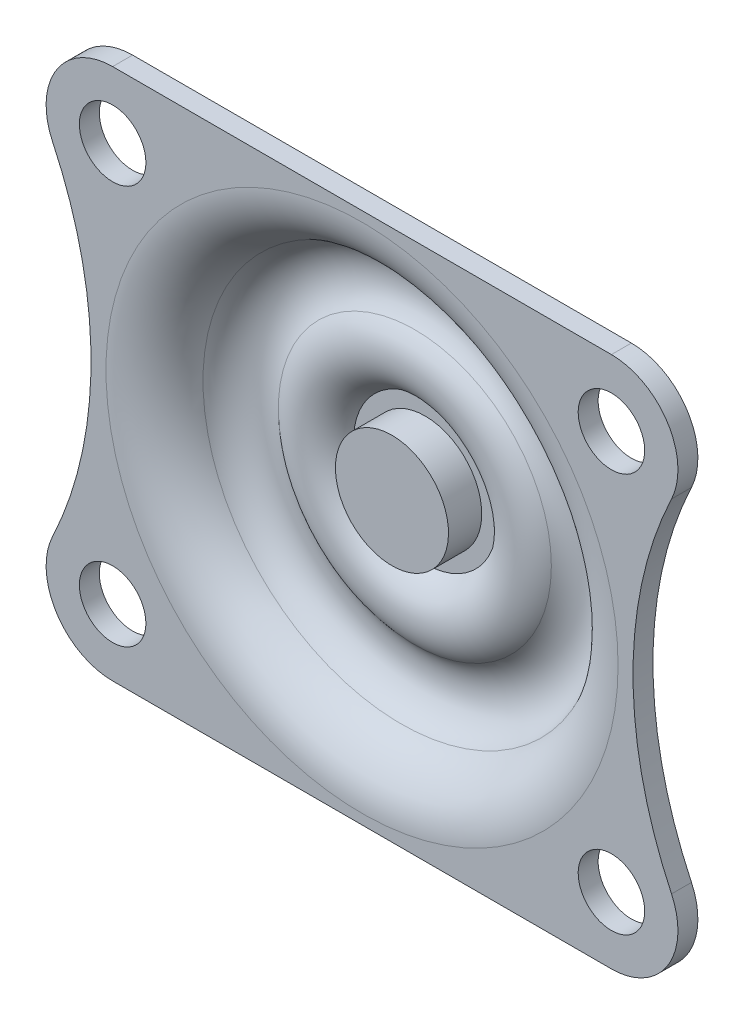
ISO-10303-21;
HEADER;
FILE_DESCRIPTION(('STEP AP214'),'2;1');
FILE_NAME('part.step','',(''),(''),'','','');
FILE_SCHEMA(('AUTOMOTIVE_DESIGN { 1 0 10303 214 1 1 1 1 }'));
ENDSEC;
DATA;
#1=APPLICATION_CONTEXT('core data for automotive mechanical design processes');
#2=APPLICATION_PROTOCOL_DEFINITION('international standard','automotive_design',2000,#1);
#3=PRODUCT_CONTEXT('',#1,'mechanical');
#4=PRODUCT('Part','Part','',(#3));
#5=PRODUCT_RELATED_PRODUCT_CATEGORY('part','',(#4));
#6=PRODUCT_DEFINITION_FORMATION('','',#4);
#7=PRODUCT_DEFINITION_CONTEXT('part definition',#1,'design');
#8=PRODUCT_DEFINITION('design','',#6,#7);
#9=PRODUCT_DEFINITION_SHAPE('','',#8);
#10=(LENGTH_UNIT() NAMED_UNIT(*) SI_UNIT(.MILLI.,.METRE.));
#11=(NAMED_UNIT(*) PLANE_ANGLE_UNIT() SI_UNIT($,.RADIAN.));
#12=(NAMED_UNIT(*) SI_UNIT($,.STERADIAN.) SOLID_ANGLE_UNIT());
#13=UNCERTAINTY_MEASURE_WITH_UNIT(LENGTH_MEASURE(1.E-05),#10,'distance_accuracy_value','');
#14=(GEOMETRIC_REPRESENTATION_CONTEXT(3) GLOBAL_UNCERTAINTY_ASSIGNED_CONTEXT((#13)) GLOBAL_UNIT_ASSIGNED_CONTEXT((#10,
#11,#12)) REPRESENTATION_CONTEXT('',''));
#15=CARTESIAN_POINT('',(0.,0.,0.));
#16=DIRECTION('',(0.,0.,1.));
#17=DIRECTION('',(1.,0.,0.));
#18=AXIS2_PLACEMENT_3D('',#15,#16,#17);
#19=CARTESIAN_POINT('',(0.,15.5,23.2));
#20=DIRECTION('',(0.,0.,1.));
#21=DIRECTION('',(0.,-1.,0.));
#22=AXIS2_PLACEMENT_3D('',#19,#20,#21);
#23=PLANE('',#22);
#24=CARTESIAN_POINT('',(0.,15.5,23.2));
#25=DIRECTION('',(0.,0.,-1.));
#26=DIRECTION('',(0.,1.,0.));
#27=AXIS2_PLACEMENT_3D('',#24,#25,#26);
#28=CIRCLE('',#27,3.4);
#29=CARTESIAN_POINT('',(0.,18.9,23.2));
#30=VERTEX_POINT('',#29);
#31=EDGE_CURVE('E19',#30,#30,#28,.T.);
#32=ORIENTED_EDGE('',*,*,#31,.F.);
#33=EDGE_LOOP('',(#32));
#34=FACE_BOUND('',#33,.T.);
#35=ADVANCED_FACE('F16',(#34),#23,.T.);
#36=CARTESIAN_POINT('',(0.,15.5,21.2));
#37=DIRECTION('',(0.,0.,-1.));
#38=DIRECTION('',(0.,1.,0.));
#39=AXIS2_PLACEMENT_3D('',#36,#37,#38);
#40=CYLINDRICAL_SURFACE('',#39,3.4);
#41=ORIENTED_EDGE('',*,*,#31,.T.);
#42=EDGE_LOOP('',(#41));
#43=FACE_BOUND('',#42,.T.);
#44=CARTESIAN_POINT('',(0.,15.5,21.2));
#45=DIRECTION('',(0.,0.,-1.));
#46=DIRECTION('',(0.,1.,0.));
#47=AXIS2_PLACEMENT_3D('',#44,#45,#46);
#48=CIRCLE('',#47,3.4);
#49=CARTESIAN_POINT('',(0.,18.9,21.2));
#50=VERTEX_POINT('',#49);
#51=EDGE_CURVE('E133',#50,#50,#48,.F.);
#52=ORIENTED_EDGE('',*,*,#51,.T.);
#53=EDGE_LOOP('',(#52));
#54=FACE_BOUND('',#53,.T.);
#55=ADVANCED_FACE('F140',(#43,#54),#40,.T.);
#56=CARTESIAN_POINT('',(0.,15.5,21.2));
#57=DIRECTION('',(0.,0.,-1.));
#58=DIRECTION('',(0.,1.,0.));
#59=AXIS2_PLACEMENT_3D('',#56,#57,#58);
#60=PLANE('',#59);
#61=ORIENTED_EDGE('',*,*,#51,.F.);
#62=EDGE_LOOP('',(#61));
#63=FACE_BOUND('',#62,.T.);
#64=CARTESIAN_POINT('',(0.,15.5,21.2));
#65=DIRECTION('',(0.,0.,1.));
#66=DIRECTION('',(0.,-1.,0.));
#67=AXIS2_PLACEMENT_3D('',#64,#65,#66);
#68=CIRCLE('',#67,4.30682878005387);
#69=CARTESIAN_POINT('',(0.,11.1931712199461,21.2));
#70=VERTEX_POINT('',#69);
#71=EDGE_CURVE('E130',#70,#70,#68,.F.);
#72=ORIENTED_EDGE('',*,*,#71,.F.);
#73=EDGE_LOOP('',(#72));
#74=FACE_BOUND('',#73,.T.);
#75=ADVANCED_FACE('F147',(#63,#74),#60,.F.);
#76=CARTESIAN_POINT('',(0.,15.5,16.7));
#77=DIRECTION('',(0.,0.,-1.));
#78=DIRECTION('',(0.,1.,0.));
#79=AXIS2_PLACEMENT_3D('',#76,#77,#78);
#80=PLANE('',#79);
#81=CARTESIAN_POINT('',(0.,15.5,16.7));
#82=DIRECTION('',(0.,0.,1.));
#83=DIRECTION('',(1.,0.,0.));
#84=AXIS2_PLACEMENT_3D('',#81,#82,#83);
#85=CIRCLE('',#84,4.49999999999996);
#86=CARTESIAN_POINT('',(4.5,15.5,16.7));
#87=VERTEX_POINT('',#86);
#88=EDGE_CURVE('E132',#87,#87,#85,.T.);
#89=ORIENTED_EDGE('',*,*,#88,.F.);
#90=EDGE_LOOP('',(#89));
#91=FACE_BOUND('',#90,.T.);
#92=ADVANCED_FACE('F337',(#91),#80,.T.);
#93=CARTESIAN_POINT('',(0.,15.5,20.));
#94=DIRECTION('',(0.,0.,1.));
#95=DIRECTION('',(1.,0.,0.));
#96=AXIS2_PLACEMENT_3D('',#93,#94,#95);
#97=TOROIDAL_SURFACE('',#96,6.5,2.5);
#98=ORIENTED_EDGE('',*,*,#71,.T.);
#99=EDGE_LOOP('',(#98));
#100=FACE_BOUND('',#99,.T.);
#101=CARTESIAN_POINT('',(0.,15.5,21.8229166666666));
#102=DIRECTION('',(0.,0.,1.));
#103=DIRECTION('',(1.,0.,0.));
#104=AXIS2_PLACEMENT_3D('',#101,#102,#103);
#105=CIRCLE('',#104,8.2108403860056);
#106=CARTESIAN_POINT('',(8.21084038600564,15.5,21.8229166666666));
#107=VERTEX_POINT('',#106);
#108=EDGE_CURVE('E310',#107,#107,#105,.T.);
#109=ORIENTED_EDGE('',*,*,#108,.T.);
#110=EDGE_LOOP('',(#109));
#111=FACE_BOUND('',#110,.T.);
#112=ADVANCED_FACE('F322',(#100,#111),#97,.T.);
#113=CARTESIAN_POINT('',(0.,15.5,17.7));
#114=DIRECTION('',(0.,0.,-1.));
#115=DIRECTION('',(1.,0.,0.));
#116=AXIS2_PLACEMENT_3D('',#113,#114,#115);
#117=TOROIDAL_SURFACE('',#116,4.5,1.);
#118=CARTESIAN_POINT('',(0.,15.5,17.7));
#119=DIRECTION('',(0.,0.,1.));
#120=DIRECTION('',(0.,-1.,0.));
#121=AXIS2_PLACEMENT_3D('',#118,#119,#120);
#122=CIRCLE('',#121,5.5);
#123=CARTESIAN_POINT('',(0.,10.,17.7));
#124=VERTEX_POINT('',#123);
#125=EDGE_CURVE('E302',#124,#124,#122,.T.);
#126=ORIENTED_EDGE('',*,*,#125,.F.);
#127=EDGE_LOOP('',(#126));
#128=FACE_BOUND('',#127,.T.);
#129=ORIENTED_EDGE('',*,*,#88,.T.);
#130=EDGE_LOOP('',(#129));
#131=FACE_BOUND('',#130,.T.);
#132=ADVANCED_FACE('F317',(#128,#131),#117,.T.);
#133=CARTESIAN_POINT('',(0.,15.5,23.5));
#134=DIRECTION('',(0.,0.,1.));
#135=DIRECTION('',(1.,0.,0.));
#136=AXIS2_PLACEMENT_3D('',#133,#134,#135);
#137=TOROIDAL_SURFACE('',#136,9.784813541131,2.3);
#138=CARTESIAN_POINT('',(0.,15.5,22.6449323278882));
#139=DIRECTION('',(0.,0.,1.));
#140=DIRECTION('',(1.,0.,0.));
#141=AXIS2_PLACEMENT_3D('',#138,#139,#140);
#142=CIRCLE('',#141,11.9199620783785);
#143=CARTESIAN_POINT('',(11.9199620783786,15.5,22.6449323278882));
#144=VERTEX_POINT('',#143);
#145=EDGE_CURVE('E129',#144,#144,#142,.F.);
#146=ORIENTED_EDGE('',*,*,#145,.F.);
#147=EDGE_LOOP('',(#146));
#148=FACE_BOUND('',#147,.T.);
#149=ORIENTED_EDGE('',*,*,#108,.F.);
#150=EDGE_LOOP('',(#149));
#151=FACE_BOUND('',#150,.T.);
#152=ADVANCED_FACE('F314',(#148,#151),#137,.F.);
#153=CARTESIAN_POINT('',(0.,15.5,18.7));
#154=DIRECTION('',(0.,0.,1.));
#155=DIRECTION('',(0.,-1.,0.));
#156=AXIS2_PLACEMENT_3D('',#153,#154,#155);
#157=CYLINDRICAL_SURFACE('',#156,5.5);
#158=ORIENTED_EDGE('',*,*,#125,.T.);
#159=EDGE_LOOP('',(#158));
#160=FACE_BOUND('',#159,.T.);
#161=CARTESIAN_POINT('',(0.,15.5,18.7));
#162=DIRECTION('',(0.,0.,1.));
#163=DIRECTION('',(0.,-1.,0.));
#164=AXIS2_PLACEMENT_3D('',#161,#162,#163);
#165=CIRCLE('',#164,5.5);
#166=CARTESIAN_POINT('',(0.,10.,18.7));
#167=VERTEX_POINT('',#166);
#168=EDGE_CURVE('E126',#167,#167,#165,.F.);
#169=ORIENTED_EDGE('',*,*,#168,.T.);
#170=EDGE_LOOP('',(#169));
#171=FACE_BOUND('',#170,.T.);
#172=ADVANCED_FACE('F294',(#160,#171),#157,.T.);
#173=CARTESIAN_POINT('',(0.,15.5,21.251273820018));
#174=DIRECTION('',(0.,0.,1.));
#175=DIRECTION('',(1.,0.,0.));
#176=AXIS2_PLACEMENT_3D('',#173,#174,#175);
#177=TOROIDAL_SURFACE('',#176,15.4,3.748726179982);
#178=ORIENTED_EDGE('',*,*,#145,.T.);
#179=EDGE_LOOP('',(#178));
#180=FACE_BOUND('',#179,.T.);
#181=CARTESIAN_POINT('',(0.,15.5,25.));
#182=DIRECTION('',(0.,0.,1.));
#183=DIRECTION('',(1.,0.,0.));
#184=AXIS2_PLACEMENT_3D('',#181,#182,#183);
#185=CIRCLE('',#184,15.4);
#186=CARTESIAN_POINT('',(15.4,15.5,25.));
#187=VERTEX_POINT('',#186);
#188=EDGE_CURVE('E125',#187,#187,#185,.T.);
#189=ORIENTED_EDGE('',*,*,#188,.T.);
#190=EDGE_LOOP('',(#189));
#191=FACE_BOUND('',#190,.T.);
#192=ADVANCED_FACE('F290',(#180,#191),#177,.T.);
#193=CARTESIAN_POINT('',(0.,15.5,18.7));
#194=DIRECTION('',(0.,0.,-1.));
#195=DIRECTION('',(0.,1.,0.));
#196=AXIS2_PLACEMENT_3D('',#193,#194,#195);
#197=PLANE('',#196);
#198=CARTESIAN_POINT('',(0.,15.5,18.7));
#199=DIRECTION('',(0.,0.,1.));
#200=DIRECTION('',(0.,-1.,0.));
#201=AXIS2_PLACEMENT_3D('',#198,#199,#200);
#202=CIRCLE('',#201,2.);
#203=CARTESIAN_POINT('',(0.,13.5,18.7));
#204=VERTEX_POINT('',#203);
#205=EDGE_CURVE('E88',#204,#204,#202,.T.);
#206=ORIENTED_EDGE('',*,*,#205,.F.);
#207=EDGE_LOOP('',(#206));
#208=FACE_BOUND('',#207,.T.);
#209=ORIENTED_EDGE('',*,*,#168,.F.);
#210=EDGE_LOOP('',(#209));
#211=FACE_BOUND('',#210,.T.);
#212=ADVANCED_FACE('F269',(#208,#211),#197,.F.);
#213=CARTESIAN_POINT('',(0.,15.5,25.));
#214=DIRECTION('',(0.,0.,-1.));
#215=DIRECTION('',(0.,1.,0.));
#216=AXIS2_PLACEMENT_3D('',#213,#214,#215);
#217=PLANE('',#216);
#218=CARTESIAN_POINT('',(-15.,27.499999999999,25.000000000001));
#219=DIRECTION('',(0.,-1.030279553951E-13,1.));
#220=DIRECTION('',(0.,-1.,-1.030279553951E-13));
#221=AXIS2_PLACEMENT_3D('',#218,#219,#220);
#222=CIRCLE('',#221,2.);
#223=CARTESIAN_POINT('',(-15.,25.499999999999,25.0000000000008));
#224=VERTEX_POINT('',#223);
#225=EDGE_CURVE('E586',#224,#224,#222,.F.);
#226=ORIENTED_EDGE('',*,*,#225,.T.);
#227=EDGE_LOOP('',(#226));
#228=FACE_BOUND('',#227,.T.);
#229=CARTESIAN_POINT('',(-15.,3.499999999999,24.999999999999));
#230=DIRECTION('',(0.,-1.030279553951E-13,1.));
#231=DIRECTION('',(0.,-1.,-1.030279553951E-13));
#232=AXIS2_PLACEMENT_3D('',#229,#230,#231);
#233=CIRCLE('',#232,2.);
#234=CARTESIAN_POINT('',(-15.,1.499999999999,24.9999999999988));
#235=VERTEX_POINT('',#234);
#236=EDGE_CURVE('E589',#235,#235,#233,.F.);
#237=ORIENTED_EDGE('',*,*,#236,.T.);
#238=EDGE_LOOP('',(#237));
#239=FACE_BOUND('',#238,.T.);
#240=CARTESIAN_POINT('',(15.,3.499999999999,24.999999999999));
#241=DIRECTION('',(0.,-1.030279553951E-13,1.));
#242=DIRECTION('',(0.,-1.,-1.030279553951E-13));
#243=AXIS2_PLACEMENT_3D('',#240,#241,#242);
#244=CIRCLE('',#243,2.);
#245=CARTESIAN_POINT('',(15.,1.499999999999,24.9999999999988));
#246=VERTEX_POINT('',#245);
#247=EDGE_CURVE('E591',#246,#246,#244,.F.);
#248=ORIENTED_EDGE('',*,*,#247,.T.);
#249=EDGE_LOOP('',(#248));
#250=FACE_BOUND('',#249,.T.);
#251=ORIENTED_EDGE('',*,*,#188,.F.);
#252=EDGE_LOOP('',(#251));
#253=FACE_BOUND('',#252,.T.);
#254=CARTESIAN_POINT('',(15.,27.499999999999,25.000000000001));
#255=DIRECTION('',(0.,-1.030279553951E-13,1.));
#256=DIRECTION('',(0.,-1.,-1.030279553951E-13));
#257=AXIS2_PLACEMENT_3D('',#254,#255,#256);
#258=CIRCLE('',#257,2.);
#259=CARTESIAN_POINT('',(15.,25.499999999999,25.0000000000008));
#260=VERTEX_POINT('',#259);
#261=EDGE_CURVE('E97',#260,#260,#258,.F.);
#262=ORIENTED_EDGE('',*,*,#261,.T.);
#263=EDGE_LOOP('',(#262));
#264=FACE_BOUND('',#263,.T.);
#265=CARTESIAN_POINT('',(15.,3.5,25.));
#266=DIRECTION('',(0.,0.,1.));
#267=DIRECTION('',(0.,-1.,0.));
#268=AXIS2_PLACEMENT_3D('',#265,#266,#267);
#269=CIRCLE('',#268,4.);
#270=CARTESIAN_POINT('',(18.6140316116209,5.21428571428583,25.));
#271=VERTEX_POINT('',#270);
#272=CARTESIAN_POINT('',(15.,-0.5,25.));
#273=VERTEX_POINT('',#272);
#274=EDGE_CURVE('E111',#271,#273,#269,.F.);
#275=ORIENTED_EDGE('',*,*,#274,.F.);
#276=CARTESIAN_POINT('',(40.298221281347,15.5,25.));
#277=DIRECTION('',(0.,0.,1.));
#278=DIRECTION('',(0.,-1.,0.));
#279=AXIS2_PLACEMENT_3D('',#276,#277,#278);
#280=CIRCLE('',#279,24.);
#281=CARTESIAN_POINT('',(18.6140316116209,25.7857142857142,25.));
#282=VERTEX_POINT('',#281);
#283=EDGE_CURVE('E116',#271,#282,#280,.F.);
#284=ORIENTED_EDGE('',*,*,#283,.T.);
#285=CARTESIAN_POINT('',(15.,27.5,25.));
#286=DIRECTION('',(0.,0.,1.));
#287=DIRECTION('',(0.,-1.,0.));
#288=AXIS2_PLACEMENT_3D('',#285,#286,#287);
#289=CIRCLE('',#288,4.);
#290=CARTESIAN_POINT('',(15.,31.5,25.));
#291=VERTEX_POINT('',#290);
#292=EDGE_CURVE('E119',#291,#282,#289,.F.);
#293=ORIENTED_EDGE('',*,*,#292,.F.);
#294=DIRECTION('',(1.,0.,0.));
#295=VECTOR('',#294,1.);
#296=CARTESIAN_POINT('',(15.,31.5,25.));
#297=LINE('',#296,#295);
#298=CARTESIAN_POINT('',(-15.,31.5,25.));
#299=VERTEX_POINT('',#298);
#300=EDGE_CURVE('E85',#299,#291,#297,.T.);
#301=ORIENTED_EDGE('',*,*,#300,.F.);
#302=CARTESIAN_POINT('',(-15.,27.5,25.));
#303=DIRECTION('',(0.,0.,1.));
#304=DIRECTION('',(0.,-1.,0.));
#305=AXIS2_PLACEMENT_3D('',#302,#303,#304);
#306=CIRCLE('',#305,4.);
#307=CARTESIAN_POINT('',(-18.6140316116179,25.7857142857151,25.));
#308=VERTEX_POINT('',#307);
#309=EDGE_CURVE('E79',#308,#299,#306,.F.);
#310=ORIENTED_EDGE('',*,*,#309,.F.);
#311=CARTESIAN_POINT('',(-40.29822128134,15.5,25.));
#312=DIRECTION('',(0.,0.,1.));
#313=DIRECTION('',(0.,-1.,0.));
#314=AXIS2_PLACEMENT_3D('',#311,#312,#313);
#315=CIRCLE('',#314,24.);
#316=CARTESIAN_POINT('',(-18.614031611615,5.2142857142835,25.));
#317=VERTEX_POINT('',#316);
#318=EDGE_CURVE('E83',#308,#317,#315,.F.);
#319=ORIENTED_EDGE('',*,*,#318,.T.);
#320=CARTESIAN_POINT('',(-15.,3.5,25.));
#321=DIRECTION('',(0.,0.,1.));
#322=DIRECTION('',(0.,-1.,0.));
#323=AXIS2_PLACEMENT_3D('',#320,#321,#322);
#324=CIRCLE('',#323,4.);
#325=CARTESIAN_POINT('',(-15.,-0.5,25.));
#326=VERTEX_POINT('',#325);
#327=EDGE_CURVE('E104',#326,#317,#324,.F.);
#328=ORIENTED_EDGE('',*,*,#327,.F.);
#329=DIRECTION('',(1.,0.,0.));
#330=VECTOR('',#329,1.);
#331=CARTESIAN_POINT('',(15.,-0.5,25.));
#332=LINE('',#331,#330);
#333=EDGE_CURVE('E279',#326,#273,#332,.T.);
#334=ORIENTED_EDGE('',*,*,#333,.T.);
#335=EDGE_LOOP('',(#275,#284,#293,#301,#310,#319,#328,#334));
#336=FACE_BOUND('',#335,.T.);
#337=ADVANCED_FACE('F81',(#228,#239,#250,#253,#264,#336),#217,.F.);
#338=CARTESIAN_POINT('',(0.,15.5,21.2));
#339=DIRECTION('',(0.,0.,1.));
#340=DIRECTION('',(0.,-1.,0.));
#341=AXIS2_PLACEMENT_3D('',#338,#339,#340);
#342=CYLINDRICAL_SURFACE('',#341,2.);
#343=CARTESIAN_POINT('',(0.,15.5,20.));
#344=DIRECTION('',(0.,0.,1.));
#345=DIRECTION('',(0.,-1.,0.));
#346=AXIS2_PLACEMENT_3D('',#343,#344,#345);
#347=CIRCLE('',#346,2.);
#348=CARTESIAN_POINT('',(0.,13.5,20.));
#349=VERTEX_POINT('',#348);
#350=EDGE_CURVE('E583',#349,#349,#347,.T.);
#351=ORIENTED_EDGE('',*,*,#350,.F.);
#352=EDGE_LOOP('',(#351));
#353=FACE_BOUND('',#352,.T.);
#354=ORIENTED_EDGE('',*,*,#205,.T.);
#355=EDGE_LOOP('',(#354));
#356=FACE_BOUND('',#355,.T.);
#357=ADVANCED_FACE('F262',(#353,#356),#342,.T.);
#358=CARTESIAN_POINT('',(-15.,27.5,25.));
#359=DIRECTION('',(0.,0.,1.));
#360=DIRECTION('',(0.,-1.,0.));
#361=AXIS2_PLACEMENT_3D('',#358,#359,#360);
#362=CYLINDRICAL_SURFACE('',#361,4.);
#363=CARTESIAN_POINT('',(-15.,27.5,23.8));
#364=DIRECTION('',(0.,0.,1.));
#365=DIRECTION('',(0.,-1.,0.));
#366=AXIS2_PLACEMENT_3D('',#363,#364,#365);
#367=CIRCLE('',#366,4.);
#368=CARTESIAN_POINT('',(-18.6140316116179,25.7857142857151,23.8));
#369=VERTEX_POINT('',#368);
#370=CARTESIAN_POINT('',(-15.,31.5,23.8));
#371=VERTEX_POINT('',#370);
#372=EDGE_CURVE('E94',#369,#371,#367,.F.);
#373=ORIENTED_EDGE('',*,*,#372,.F.);
#374=DIRECTION('',(0.,0.,1.));
#375=VECTOR('',#374,1.);
#376=CARTESIAN_POINT('',(-18.614031611615,25.7857142857164,25.));
#377=LINE('',#376,#375);
#378=EDGE_CURVE('E91',#369,#308,#377,.T.);
#379=ORIENTED_EDGE('',*,*,#378,.T.);
#380=ORIENTED_EDGE('',*,*,#309,.T.);
#381=DIRECTION('',(0.,0.,1.));
#382=VECTOR('',#381,1.);
#383=CARTESIAN_POINT('',(-15.,31.5,25.));
#384=LINE('',#383,#382);
#385=EDGE_CURVE('E121',#371,#299,#384,.T.);
#386=ORIENTED_EDGE('',*,*,#385,.F.);
#387=EDGE_LOOP('',(#373,#379,#380,#386));
#388=FACE_BOUND('',#387,.T.);
#389=ADVANCED_FACE('F92',(#388),#362,.T.);
#390=CARTESIAN_POINT('',(15.,31.5,25.));
#391=DIRECTION('',(0.,1.,0.));
#392=DIRECTION('',(0.,0.,1.));
#393=AXIS2_PLACEMENT_3D('',#390,#391,#392);
#394=PLANE('',#393);
#395=DIRECTION('',(1.,0.,0.));
#396=VECTOR('',#395,1.);
#397=CARTESIAN_POINT('',(0.,31.5,23.8));
#398=LINE('',#397,#396);
#399=CARTESIAN_POINT('',(15.,31.5,23.8));
#400=VERTEX_POINT('',#399);
#401=EDGE_CURVE('E581',#371,#400,#398,.T.);
#402=ORIENTED_EDGE('',*,*,#401,.F.);
#403=ORIENTED_EDGE('',*,*,#385,.T.);
#404=ORIENTED_EDGE('',*,*,#300,.T.);
#405=DIRECTION('',(0.,0.,1.));
#406=VECTOR('',#405,1.);
#407=CARTESIAN_POINT('',(15.,31.5,25.));
#408=LINE('',#407,#406);
#409=EDGE_CURVE('E118',#400,#291,#408,.T.);
#410=ORIENTED_EDGE('',*,*,#409,.F.);
#411=EDGE_LOOP('',(#402,#403,#404,#410));
#412=FACE_BOUND('',#411,.T.);
#413=ADVANCED_FACE('F255',(#412),#394,.T.);
#414=CARTESIAN_POINT('',(15.,27.5,25.));
#415=DIRECTION('',(0.,0.,1.));
#416=DIRECTION('',(0.,-1.,0.));
#417=AXIS2_PLACEMENT_3D('',#414,#415,#416);
#418=CYLINDRICAL_SURFACE('',#417,4.);
#419=CARTESIAN_POINT('',(15.,27.5,23.8));
#420=DIRECTION('',(0.,0.,1.));
#421=DIRECTION('',(0.,-1.,0.));
#422=AXIS2_PLACEMENT_3D('',#419,#420,#421);
#423=CIRCLE('',#422,4.);
#424=CARTESIAN_POINT('',(18.6140316116209,25.7857142857142,23.8));
#425=VERTEX_POINT('',#424);
#426=EDGE_CURVE('E578',#400,#425,#423,.F.);
#427=ORIENTED_EDGE('',*,*,#426,.F.);
#428=ORIENTED_EDGE('',*,*,#409,.T.);
#429=ORIENTED_EDGE('',*,*,#292,.T.);
#430=DIRECTION('',(0.,0.,1.));
#431=VECTOR('',#430,1.);
#432=CARTESIAN_POINT('',(18.6140316116209,25.7857142857141,25.));
#433=LINE('',#432,#431);
#434=EDGE_CURVE('E115',#282,#425,#433,.F.);
#435=ORIENTED_EDGE('',*,*,#434,.T.);
#436=EDGE_LOOP('',(#427,#428,#429,#435));
#437=FACE_BOUND('',#436,.T.);
#438=ADVANCED_FACE('F251',(#437),#418,.T.);
#439=CARTESIAN_POINT('',(40.298221281347,15.5,25.));
#440=DIRECTION('',(0.,0.,1.));
#441=DIRECTION('',(0.,-1.,0.));
#442=AXIS2_PLACEMENT_3D('',#439,#440,#441);
#443=CYLINDRICAL_SURFACE('',#442,24.);
#444=CARTESIAN_POINT('',(40.298221281347,15.5,23.8));
#445=DIRECTION('',(0.,0.,1.));
#446=DIRECTION('',(0.,-1.,0.));
#447=AXIS2_PLACEMENT_3D('',#444,#445,#446);
#448=CIRCLE('',#447,24.);
#449=CARTESIAN_POINT('',(18.6140316116209,5.21428571428583,23.8));
#450=VERTEX_POINT('',#449);
#451=EDGE_CURVE('E575',#425,#450,#448,.T.);
#452=ORIENTED_EDGE('',*,*,#451,.F.);
#453=ORIENTED_EDGE('',*,*,#434,.F.);
#454=ORIENTED_EDGE('',*,*,#283,.F.);
#455=DIRECTION('',(0.,0.,1.));
#456=VECTOR('',#455,1.);
#457=CARTESIAN_POINT('',(18.6140316116209,5.21428571428595,25.));
#458=LINE('',#457,#456);
#459=EDGE_CURVE('E114',#450,#271,#458,.T.);
#460=ORIENTED_EDGE('',*,*,#459,.F.);
#461=EDGE_LOOP('',(#452,#453,#454,#460));
#462=FACE_BOUND('',#461,.T.);
#463=ADVANCED_FACE('F247',(#462),#443,.F.);
#464=CARTESIAN_POINT('',(15.,3.5,25.));
#465=DIRECTION('',(0.,0.,1.));
#466=DIRECTION('',(0.,-1.,0.));
#467=AXIS2_PLACEMENT_3D('',#464,#465,#466);
#468=CYLINDRICAL_SURFACE('',#467,4.);
#469=CARTESIAN_POINT('',(15.,3.5,23.8));
#470=DIRECTION('',(0.,0.,1.));
#471=DIRECTION('',(0.,-1.,0.));
#472=AXIS2_PLACEMENT_3D('',#469,#470,#471);
#473=CIRCLE('',#472,4.);
#474=CARTESIAN_POINT('',(15.,-0.500000000000001,23.8));
#475=VERTEX_POINT('',#474);
#476=EDGE_CURVE('E572',#450,#475,#473,.F.);
#477=ORIENTED_EDGE('',*,*,#476,.F.);
#478=ORIENTED_EDGE('',*,*,#459,.T.);
#479=ORIENTED_EDGE('',*,*,#274,.T.);
#480=DIRECTION('',(0.,0.,1.));
#481=VECTOR('',#480,1.);
#482=CARTESIAN_POINT('',(15.,-0.5,25.));
#483=LINE('',#482,#481);
#484=EDGE_CURVE('E110',#273,#475,#483,.F.);
#485=ORIENTED_EDGE('',*,*,#484,.T.);
#486=EDGE_LOOP('',(#477,#478,#479,#485));
#487=FACE_BOUND('',#486,.T.);
#488=ADVANCED_FACE('F243',(#487),#468,.T.);
#489=CARTESIAN_POINT('',(15.,-0.5,25.));
#490=DIRECTION('',(0.,1.,0.));
#491=DIRECTION('',(0.,0.,1.));
#492=AXIS2_PLACEMENT_3D('',#489,#490,#491);
#493=PLANE('',#492);
#494=DIRECTION('',(1.,0.,0.));
#495=VECTOR('',#494,1.);
#496=CARTESIAN_POINT('',(0.,-0.5,23.8));
#497=LINE('',#496,#495);
#498=CARTESIAN_POINT('',(-15.,-0.500000000000001,23.8));
#499=VERTEX_POINT('',#498);
#500=EDGE_CURVE('E571',#475,#499,#497,.F.);
#501=ORIENTED_EDGE('',*,*,#500,.F.);
#502=ORIENTED_EDGE('',*,*,#484,.F.);
#503=ORIENTED_EDGE('',*,*,#333,.F.);
#504=DIRECTION('',(0.,0.,1.));
#505=VECTOR('',#504,1.);
#506=CARTESIAN_POINT('',(-15.,-0.5,25.));
#507=LINE('',#506,#505);
#508=EDGE_CURVE('E100',#499,#326,#507,.T.);
#509=ORIENTED_EDGE('',*,*,#508,.F.);
#510=EDGE_LOOP('',(#501,#502,#503,#509));
#511=FACE_BOUND('',#510,.T.);
#512=ADVANCED_FACE('F240',(#511),#493,.F.);
#513=CARTESIAN_POINT('',(-15.,3.5,25.));
#514=DIRECTION('',(0.,0.,1.));
#515=DIRECTION('',(0.,-1.,0.));
#516=AXIS2_PLACEMENT_3D('',#513,#514,#515);
#517=CYLINDRICAL_SURFACE('',#516,4.);
#518=CARTESIAN_POINT('',(-15.,3.5,23.8));
#519=DIRECTION('',(0.,0.,1.));
#520=DIRECTION('',(0.,-1.,0.));
#521=AXIS2_PLACEMENT_3D('',#518,#519,#520);
#522=CIRCLE('',#521,4.);
#523=CARTESIAN_POINT('',(-18.614031611615,5.2142857142835,23.8));
#524=VERTEX_POINT('',#523);
#525=EDGE_CURVE('E568',#499,#524,#522,.F.);
#526=ORIENTED_EDGE('',*,*,#525,.F.);
#527=ORIENTED_EDGE('',*,*,#508,.T.);
#528=ORIENTED_EDGE('',*,*,#327,.T.);
#529=DIRECTION('',(0.,0.,1.));
#530=VECTOR('',#529,1.);
#531=CARTESIAN_POINT('',(-18.614031611615,5.21428571428362,25.));
#532=LINE('',#531,#530);
#533=EDGE_CURVE('E34',#317,#524,#532,.F.);
#534=ORIENTED_EDGE('',*,*,#533,.T.);
#535=EDGE_LOOP('',(#526,#527,#528,#534));
#536=FACE_BOUND('',#535,.T.);
#537=ADVANCED_FACE('F237',(#536),#517,.T.);
#538=CARTESIAN_POINT('',(-40.29822128134,15.5,25.));
#539=DIRECTION('',(0.,0.,1.));
#540=DIRECTION('',(0.,-1.,0.));
#541=AXIS2_PLACEMENT_3D('',#538,#539,#540);
#542=CYLINDRICAL_SURFACE('',#541,24.);
#543=CARTESIAN_POINT('',(-40.29822128134,15.5,23.8));
#544=DIRECTION('',(0.,0.,1.));
#545=DIRECTION('',(0.,-1.,0.));
#546=AXIS2_PLACEMENT_3D('',#543,#544,#545);
#547=CIRCLE('',#546,24.);
#548=EDGE_CURVE('E566',#524,#369,#547,.T.);
#549=ORIENTED_EDGE('',*,*,#548,.F.);
#550=ORIENTED_EDGE('',*,*,#533,.F.);
#551=ORIENTED_EDGE('',*,*,#318,.F.);
#552=ORIENTED_EDGE('',*,*,#378,.F.);
#553=EDGE_LOOP('',(#549,#550,#551,#552));
#554=FACE_BOUND('',#553,.T.);
#555=ADVANCED_FACE('F99',(#554),#542,.F.);
#556=CARTESIAN_POINT('',(15.,27.499999999999,25.000000000001));
#557=DIRECTION('',(0.,-1.030279553951E-13,1.));
#558=DIRECTION('',(0.,-1.,-1.030279553951E-13));
#559=AXIS2_PLACEMENT_3D('',#556,#557,#558);
#560=CYLINDRICAL_SURFACE('',#559,2.);
#561=CARTESIAN_POINT('',(15.,27.4999999999991,23.8));
#562=DIRECTION('',(0.,-1.030279553951E-13,1.));
#563=DIRECTION('',(0.,-1.,-1.030279553951E-13));
#564=AXIS2_PLACEMENT_3D('',#561,#562,#563);
#565=CIRCLE('',#564,2.);
#566=CARTESIAN_POINT('',(15.,25.4999999999991,23.7999999999998));
#567=VERTEX_POINT('',#566);
#568=EDGE_CURVE('E563',#567,#567,#565,.T.);
#569=ORIENTED_EDGE('',*,*,#568,.F.);
#570=EDGE_LOOP('',(#569));
#571=FACE_BOUND('',#570,.T.);
#572=ORIENTED_EDGE('',*,*,#261,.F.);
#573=EDGE_LOOP('',(#572));
#574=FACE_BOUND('',#573,.T.);
#575=ADVANCED_FACE('F230',(#571,#574),#560,.F.);
#576=CARTESIAN_POINT('',(15.,3.499999999999,24.999999999999));
#577=DIRECTION('',(0.,-1.030279553951E-13,1.));
#578=DIRECTION('',(0.,-1.,-1.030279553951E-13));
#579=AXIS2_PLACEMENT_3D('',#576,#577,#578);
#580=CYLINDRICAL_SURFACE('',#579,2.);
#581=CARTESIAN_POINT('',(15.,3.49999999999912,23.8));
#582=DIRECTION('',(0.,-1.030279553951E-13,1.));
#583=DIRECTION('',(0.,-1.,-1.030279553951E-13));
#584=AXIS2_PLACEMENT_3D('',#581,#582,#583);
#585=CIRCLE('',#584,2.);
#586=CARTESIAN_POINT('',(15.,1.49999999999912,23.7999999999998));
#587=VERTEX_POINT('',#586);
#588=EDGE_CURVE('E556',#587,#587,#585,.T.);
#589=ORIENTED_EDGE('',*,*,#588,.F.);
#590=EDGE_LOOP('',(#589));
#591=FACE_BOUND('',#590,.T.);
#592=ORIENTED_EDGE('',*,*,#247,.F.);
#593=EDGE_LOOP('',(#592));
#594=FACE_BOUND('',#593,.T.);
#595=ADVANCED_FACE('F226',(#591,#594),#580,.F.);
#596=CARTESIAN_POINT('',(-15.,3.499999999999,24.999999999999));
#597=DIRECTION('',(0.,-1.030279553951E-13,1.));
#598=DIRECTION('',(0.,-1.,-1.030279553951E-13));
#599=AXIS2_PLACEMENT_3D('',#596,#597,#598);
#600=CYLINDRICAL_SURFACE('',#599,2.);
#601=CARTESIAN_POINT('',(-15.,3.49999999999912,23.8));
#602=DIRECTION('',(0.,-1.030279553951E-13,1.));
#603=DIRECTION('',(0.,-1.,-1.030279553951E-13));
#604=AXIS2_PLACEMENT_3D('',#601,#602,#603);
#605=CIRCLE('',#604,2.);
#606=CARTESIAN_POINT('',(-15.,1.49999999999912,23.7999999999998));
#607=VERTEX_POINT('',#606);
#608=EDGE_CURVE('E552',#607,#607,#605,.T.);
#609=ORIENTED_EDGE('',*,*,#608,.F.);
#610=EDGE_LOOP('',(#609));
#611=FACE_BOUND('',#610,.T.);
#612=ORIENTED_EDGE('',*,*,#236,.F.);
#613=EDGE_LOOP('',(#612));
#614=FACE_BOUND('',#613,.T.);
#615=ADVANCED_FACE('F222',(#611,#614),#600,.F.);
#616=CARTESIAN_POINT('',(-15.,27.499999999999,25.000000000001));
#617=DIRECTION('',(0.,-1.030279553951E-13,1.));
#618=DIRECTION('',(0.,-1.,-1.030279553951E-13));
#619=AXIS2_PLACEMENT_3D('',#616,#617,#618);
#620=CYLINDRICAL_SURFACE('',#619,2.);
#621=CARTESIAN_POINT('',(-15.,27.4999999999991,23.8));
#622=DIRECTION('',(0.,-1.030279553951E-13,1.));
#623=DIRECTION('',(0.,-1.,-1.030279553951E-13));
#624=AXIS2_PLACEMENT_3D('',#621,#622,#623);
#625=CIRCLE('',#624,2.);
#626=CARTESIAN_POINT('',(-15.,25.4999999999991,23.7999999999998));
#627=VERTEX_POINT('',#626);
#628=EDGE_CURVE('E550',#627,#627,#625,.T.);
#629=ORIENTED_EDGE('',*,*,#628,.F.);
#630=EDGE_LOOP('',(#629));
#631=FACE_BOUND('',#630,.T.);
#632=ORIENTED_EDGE('',*,*,#225,.F.);
#633=EDGE_LOOP('',(#632));
#634=FACE_BOUND('',#633,.T.);
#635=ADVANCED_FACE('F217',(#631,#634),#620,.F.);
#636=CARTESIAN_POINT('',(0.,15.5,20.));
#637=DIRECTION('',(0.,0.,-1.));
#638=DIRECTION('',(0.,1.,0.));
#639=AXIS2_PLACEMENT_3D('',#636,#637,#638);
#640=PLANE('',#639);
#641=ORIENTED_EDGE('',*,*,#350,.T.);
#642=EDGE_LOOP('',(#641));
#643=FACE_BOUND('',#642,.T.);
#644=CARTESIAN_POINT('',(4.428768482279,15.5,20.));
#645=CARTESIAN_POINT('',(4.428768482279,16.871211960348,20.));
#646=CARTESIAN_POINT('',(3.956981608046,18.263214356553,20.));
#647=CARTESIAN_POINT('',(2.989877235484,19.480731644762,20.));
#648=CARTESIAN_POINT('',(1.60338822241,20.31015550444,20.));
#649=CARTESIAN_POINT('',(-0.001145893724447,20.592756766404,20.));
#650=CARTESIAN_POINT('',(-1.599676036174,20.303365825612,20.));
#651=CARTESIAN_POINT('',(-2.972007799137,19.483028191756,20.));
#652=CARTESIAN_POINT('',(-3.943055789614,18.282719171847,20.));
#653=CARTESIAN_POINT('',(-4.428768482279,16.891338652838,20.));
#654=CARTESIAN_POINT('',(-4.428768482279,14.108661347162,20.));
#655=CARTESIAN_POINT('',(-3.943055789615,12.717280828153,20.));
#656=CARTESIAN_POINT('',(-2.972007799134,11.516971808244,20.));
#657=CARTESIAN_POINT('',(-1.599676036176,10.696634174387,20.));
#658=CARTESIAN_POINT('',(-0.001145893723174,10.407243233597,20.));
#659=CARTESIAN_POINT('',(1.60338822241,10.689844495559,20.));
#660=CARTESIAN_POINT('',(2.989877235482,11.519268355238,20.));
#661=CARTESIAN_POINT('',(3.956981608046,12.736785643447,20.));
#662=CARTESIAN_POINT('',(4.428768482279,14.128788039652,20.));
#663=CARTESIAN_POINT('',(4.428768482279,15.5,20.));
#664=(BOUNDED_CURVE() B_SPLINE_CURVE(10,(#644,#645,#646,#647,#648,#649,#650,#651,#652,#653,#654,
#655,#656,#657,#658,#659,#660,#661,#662,#663),.UNSPECIFIED.,.T.,
.F.) B_SPLINE_CURVE_WITH_KNOTS((11,9,11),(0.,16.336281798667,32.672563597334),
.UNSPECIFIED.) CURVE() GEOMETRIC_REPRESENTATION_ITEM() RATIONAL_B_SPLINE_CURVE((1.,1.,1.,1.,1.,
1.,1.,1.,1.,1.,1.,1.,1.,1.,1.000000000001,0.999999999999,1.,1.,1.,1.)) REPRESENTATION_ITEM(''));
#665=CARTESIAN_POINT('',(4.428768482279,15.5,20.));
#666=VERTEX_POINT('',#665);
#667=EDGE_CURVE('E201',#666,#666,#664,.T.);
#668=ORIENTED_EDGE('',*,*,#667,.F.);
#669=EDGE_LOOP('',(#668));
#670=FACE_BOUND('',#669,.T.);
#671=ADVANCED_FACE('F207',(#643,#670),#640,.T.);
#672=CARTESIAN_POINT('',(0.,15.5,23.8));
#673=DIRECTION('',(0.,0.,-1.));
#674=DIRECTION('',(0.,1.,0.));
#675=AXIS2_PLACEMENT_3D('',#672,#673,#674);
#676=PLANE('',#675);
#677=ORIENTED_EDGE('',*,*,#628,.T.);
#678=EDGE_LOOP('',(#677));
#679=FACE_BOUND('',#678,.T.);
#680=ORIENTED_EDGE('',*,*,#608,.T.);
#681=EDGE_LOOP('',(#680));
#682=FACE_BOUND('',#681,.T.);
#683=ORIENTED_EDGE('',*,*,#588,.T.);
#684=EDGE_LOOP('',(#683));
#685=FACE_BOUND('',#684,.T.);
#686=CARTESIAN_POINT('',(0.,15.5,23.8));
#687=DIRECTION('',(0.,0.,-1.));
#688=DIRECTION('',(1.,0.,0.));
#689=AXIS2_PLACEMENT_3D('',#686,#687,#688);
#690=CIRCLE('',#689,15.4);
#691=CARTESIAN_POINT('',(15.4,15.5,23.8));
#692=VERTEX_POINT('',#691);
#693=EDGE_CURVE('E171',#692,#692,#690,.F.);
#694=ORIENTED_EDGE('',*,*,#693,.T.);
#695=EDGE_LOOP('',(#694));
#696=FACE_BOUND('',#695,.T.);
#697=ORIENTED_EDGE('',*,*,#568,.T.);
#698=EDGE_LOOP('',(#697));
#699=FACE_BOUND('',#698,.T.);
#700=ORIENTED_EDGE('',*,*,#525,.T.);
#701=ORIENTED_EDGE('',*,*,#548,.T.);
#702=ORIENTED_EDGE('',*,*,#372,.T.);
#703=ORIENTED_EDGE('',*,*,#401,.T.);
#704=ORIENTED_EDGE('',*,*,#426,.T.);
#705=ORIENTED_EDGE('',*,*,#451,.T.);
#706=ORIENTED_EDGE('',*,*,#476,.T.);
#707=ORIENTED_EDGE('',*,*,#500,.T.);
#708=EDGE_LOOP('',(#700,#701,#702,#703,#704,#705,#706,#707));
#709=FACE_BOUND('',#708,.T.);
#710=ADVANCED_FACE('F216',(#679,#682,#685,#696,#699,#709),#676,.T.);
#711=CARTESIAN_POINT('',(4.428768482279,15.5,20.));
#712=CARTESIAN_POINT('',(4.428768482279,14.128788039652,20.));
#713=CARTESIAN_POINT('',(3.956981608046,12.736785643447,20.));
#714=CARTESIAN_POINT('',(2.989877235482,11.519268355238,20.));
#715=CARTESIAN_POINT('',(1.60338822241,10.689844495559,20.));
#716=CARTESIAN_POINT('',(-0.001145893723174,10.407243233597,20.));
#717=CARTESIAN_POINT('',(-1.599676036176,10.696634174387,20.));
#718=CARTESIAN_POINT('',(-2.972007799134,11.516971808244,20.));
#719=CARTESIAN_POINT('',(-3.943055789615,12.717280828153,20.));
#720=CARTESIAN_POINT('',(-4.428768482279,14.108661347162,20.));
#721=CARTESIAN_POINT('',(-4.428768482279,16.891338652838,20.));
#722=CARTESIAN_POINT('',(-3.943055789614,18.282719171847,20.));
#723=CARTESIAN_POINT('',(-2.972007799137,19.483028191756,20.));
#724=CARTESIAN_POINT('',(-1.599676036174,20.303365825612,20.));
#725=CARTESIAN_POINT('',(-0.001145893724447,20.592756766404,20.));
#726=CARTESIAN_POINT('',(1.60338822241,20.31015550444,20.));
#727=CARTESIAN_POINT('',(2.989877235484,19.480731644762,20.));
#728=CARTESIAN_POINT('',(3.956981608046,18.263214356553,20.));
#729=CARTESIAN_POINT('',(4.428768482279,16.871211960348,20.));
#730=CARTESIAN_POINT('',(4.428768482279,15.5,20.));
#731=CARTESIAN_POINT('',(5.05641439674,15.5,20.));
#732=CARTESIAN_POINT('',(5.05641439674,13.93445961896,20.));
#733=CARTESIAN_POINT('',(4.517765796659,12.345182377526,20.));
#734=CARTESIAN_POINT('',(3.41360320786,10.955118306889,20.));
#735=CARTESIAN_POINT('',(1.830620707269,10.008148339538,20.));
#736=CARTESIAN_POINT('',(-0.001308290000868,9.685496772799,20.));
#737=CARTESIAN_POINT('',(-1.826382429292,10.015900252945,20.));
#738=CARTESIAN_POINT('',(-3.393201311583,10.952496292818,20.));
#739=CARTESIAN_POINT('',(-4.501866408581,12.322913336086,20.));
#740=CARTESIAN_POINT('',(-5.05641439674,13.91148056777,20.));
#741=CARTESIAN_POINT('',(-5.05641439674,17.088519432231,20.));
#742=CARTESIAN_POINT('',(-4.501866408581,18.677086663914,20.));
#743=CARTESIAN_POINT('',(-3.393201311585,20.047503707182,20.));
#744=CARTESIAN_POINT('',(-1.826382429291,20.984099747056,20.));
#745=CARTESIAN_POINT('',(-0.001308290001878,21.314503227201,20.));
#746=CARTESIAN_POINT('',(1.830620707268,20.991851660463,20.));
#747=CARTESIAN_POINT('',(3.413603207861,20.04488169311,20.));
#748=CARTESIAN_POINT('',(4.517765796658,18.654817622474,20.));
#749=CARTESIAN_POINT('',(5.05641439674,17.06554038104,20.));
#750=CARTESIAN_POINT('',(5.05641439674,15.5,20.));
#751=CARTESIAN_POINT('',(5.329303924767,15.5,20.565217391304));
#752=CARTESIAN_POINT('',(5.329303924766,13.849969001268,20.565217391304));
#753=CARTESIAN_POINT('',(4.761585009099,12.174920087995,20.565217391304));
#754=CARTESIAN_POINT('',(3.597831891502,10.709835677173,20.565217391304));
#755=CARTESIAN_POINT('',(1.929417439816,9.711758706483,20.565217391304));
#756=CARTESIAN_POINT('',(-0.001378897078452,9.371693963758,20.565217391304));
#757=CARTESIAN_POINT('',(-1.924950426299,9.71992898275,20.565217391304));
#758=CARTESIAN_POINT('',(-3.576328925692,10.707072155677,20.565217391304));
#759=CARTESIAN_POINT('',(-4.744827547263,12.1514492091,20.565217391304));
#760=CARTESIAN_POINT('',(-5.329303924766,13.825749794121,20.565217391304));
#761=CARTESIAN_POINT('',(-5.329303924767,17.174250205879,20.565217391304));
#762=CARTESIAN_POINT('',(-4.744827547262,18.8485507909,20.565217391304));
#763=CARTESIAN_POINT('',(-3.576328925693,20.292927844324,20.565217391304));
#764=CARTESIAN_POINT('',(-1.924950426298,21.280071017249,20.565217391304));
#765=CARTESIAN_POINT('',(-0.001378897078704,21.628306036243,20.565217391304));
#766=CARTESIAN_POINT('',(1.929417439815,21.288241293517,20.565217391304));
#767=CARTESIAN_POINT('',(3.597831891504,20.290164322827,20.565217391304));
#768=CARTESIAN_POINT('',(4.761585009098,18.825079912006,20.565217391304));
#769=CARTESIAN_POINT('',(5.329303924767,17.150030998732,20.565217391304));
#770=CARTESIAN_POINT('',(5.329303924767,15.5,20.565217391304));
#771=CARTESIAN_POINT('',(5.33161527056297,15.5,20.5700047235649));
#772=CARTESIAN_POINT('',(5.33161527056196,13.8492533745622,20.5700047235649));
#773=CARTESIAN_POINT('',(4.76365013235867,12.1734779841885,20.5700047235649));
#774=CARTESIAN_POINT('',(3.59939228920766,10.7077581589219,20.5700047235649));
#775=CARTESIAN_POINT('',(1.93025423782023,9.7092483172523,20.5700047235649));
#776=CARTESIAN_POINT('',(-0.00137949511302342,9.36903608674571,20.5700047235649));
#777=CARTESIAN_POINT('',(-1.9257852869371,9.71742213700902,20.5700047235649));
#778=CARTESIAN_POINT('',(-3.57787999745374,10.7049934388728,20.5700047235649));
#779=CARTESIAN_POINT('',(-4.74688540272758,12.1499969258558,20.5700047235649));
#780=CARTESIAN_POINT('',(-5.33161527056196,13.8250236634237,20.5700047235649));
#781=CARTESIAN_POINT('',(-5.33161527056297,17.1749763365762,20.5700047235649));
#782=CARTESIAN_POINT('',(-4.74688540272657,18.8500030741442,20.5700047235649));
#783=CARTESIAN_POINT('',(-3.57787999745473,20.2950065611282,20.5700047235649));
#784=CARTESIAN_POINT('',(-1.9257852869361,21.28257786299,20.5700047235649));
#785=CARTESIAN_POINT('',(-0.001379495113269,21.6309639132553,20.5700047235649));
#786=CARTESIAN_POINT('',(1.93025423781923,21.2907516827477,20.5700047235649));
#787=CARTESIAN_POINT('',(3.59939228920967,20.2922418410781,20.5700047235649));
#788=CARTESIAN_POINT('',(4.76365013235767,18.8265220158125,20.5700047235649));
#789=CARTESIAN_POINT('',(5.33161527056297,17.1507466254378,20.5700047235649));
#790=CARTESIAN_POINT('',(5.33161527056297,15.5,20.5700047235649));
#791=CARTESIAN_POINT('',(5.33392661635893,15.5,20.5747920558259));
#792=CARTESIAN_POINT('',(5.33392661635792,13.8485377478563,20.5747920558259));
#793=CARTESIAN_POINT('',(4.76571525561834,12.172035880382,20.5747920558259));
#794=CARTESIAN_POINT('',(3.60095268691332,10.7056806406707,20.5747920558259));
#795=CARTESIAN_POINT('',(1.93109103582446,9.7067379280216,20.5747920558259));
#796=CARTESIAN_POINT('',(-0.00138009314759484,9.36637820973341,20.5747920558259));
#797=CARTESIAN_POINT('',(-1.9266201475752,9.71491529126804,20.5747920558259));
#798=CARTESIAN_POINT('',(-3.57943106921547,10.7029147220685,20.5747920558259));
#799=CARTESIAN_POINT('',(-4.74894325819215,12.1485446426116,20.5747920558259));
#800=CARTESIAN_POINT('',(-5.33392661635792,13.8242975327265,20.5747920558259));
#801=CARTESIAN_POINT('',(-5.33392661635893,17.1757024672735,20.5747920558259));
#802=CARTESIAN_POINT('',(-4.74894325819113,18.8514553573884,20.5747920558259));
#803=CARTESIAN_POINT('',(-3.57943106921646,20.2970852779325,20.5747920558259));
#804=CARTESIAN_POINT('',(-1.9266201475742,21.2850847087309,20.5747920558259));
#805=CARTESIAN_POINT('',(-0.001380093147834,21.6336217902676,20.5747920558259));
#806=CARTESIAN_POINT('',(1.93109103582346,21.2932620719784,20.5747920558259));
#807=CARTESIAN_POINT('',(3.60095268691534,20.2943193593293,20.5747920558259));
#808=CARTESIAN_POINT('',(4.76571525561734,18.827964119619,20.5747920558259));
#809=CARTESIAN_POINT('',(5.33392661635893,17.1514622521437,20.5747920558259));
#810=CARTESIAN_POINT('',(5.33392661635893,15.5,20.5747920558259));
#811=(BOUNDED_SURFACE() B_SPLINE_SURFACE(2,10,((#711,#712,#713,#714,#715,#716,#717,#718,#719,
#720,#721,#722,#723,#724,#725,#726,#727,#728,#729,#730),(#731,#732,#733,#734,#735,#736,#737,
#738,#739,#740,#741,#742,#743,#744,#745,#746,#747,#748,#749,#750),(#751,#752,#753,#754,#755,
#756,#757,#758,#759,#760,#761,#762,#763,#764,#765,#766,#767,#768,#769,#770),(#771,#772,#773,
#774,#775,#776,#777,#778,#779,#780,#781,#782,#783,#784,#785,#786,#787,#788,#789,#790),(#791,
#792,#793,#794,#795,#796,#797,#798,#799,#800,#801,#802,#803,#804,#805,#806,#807,#808,#809,
#810)),.UNSPECIFIED.,.F.,.T.,.F.) B_SPLINE_SURFACE_WITH_KNOTS((3,2,3),(11,9,11),(0.,
32.672563597334,32.9992892333073),(0.,16.336281798667,32.672563597334),
.UNSPECIFIED.) GEOMETRIC_REPRESENTATION_ITEM() RATIONAL_B_SPLINE_SURFACE(((1.,1.,1.,1.,
0.999999999999,1.000000000001,1.,1.,1.,1.,1.,1.,1.,1.,1.,1.,1.,1.,1.,1.),(0.84698955386,
0.84698955386,0.84698955386,0.84698955386,0.846989553859,0.84698955386,0.84698955386,
0.84698955386,0.84698955386,0.84698955386,0.84698955386,0.84698955386,0.84698955386,
0.84698955386,0.84698955386,0.84698955386,0.84698955386,0.84698955386,0.84698955386,
0.84698955386),(1.,1.,1.,1.,0.999999999999,1.000000000001,1.,1.,1.,1.,1.,1.,1.,1.,1.,1.,1.,1.,
1.,1.),(1.,1.,1.,1.,0.999999999999,1.000000000001,1.,1.,1.,1.,1.,1.,1.,1.,1.,1.,1.,1.,1.,1.),
(1.,1.,1.,1.,0.999999999999,1.000000000001,1.,1.,1.,1.,1.,1.,1.,1.,1.,1.,1.,1.,1.,1.))) REPRESENTATION_ITEM('') SURFACE());
#812=CARTESIAN_POINT('',(0.,15.5,20.5652173913042));
#813=DIRECTION('',(0.,0.,1.));
#814=DIRECTION('',(1.,0.,0.));
#815=AXIS2_PLACEMENT_3D('',#812,#813,#814);
#816=CIRCLE('',#815,5.32930392476645);
#817=CARTESIAN_POINT('',(5.3293039247665,15.5,20.5652173913042));
#818=VERTEX_POINT('',#817);
#819=EDGE_CURVE('E166',#818,#818,#816,.F.);
#820=ORIENTED_EDGE('',*,*,#819,.T.);
#821=EDGE_LOOP('',(#820));
#822=FACE_BOUND('',#821,.T.);
#823=ORIENTED_EDGE('',*,*,#667,.T.);
#824=EDGE_LOOP('',(#823));
#825=FACE_BOUND('',#824,.T.);
#826=ADVANCED_FACE('F179',(#822,#825),#811,.T.);
#827=CARTESIAN_POINT('',(0.,15.5,21.251273820018));
#828=DIRECTION('',(0.,0.,1.));
#829=DIRECTION('',(1.,0.,0.));
#830=AXIS2_PLACEMENT_3D('',#827,#828,#829);
#831=TOROIDAL_SURFACE('',#830,15.4,2.548726179982);
#832=CARTESIAN_POINT('',(0.,15.5,22.198810064178));
#833=DIRECTION('',(0.,0.,1.));
#834=DIRECTION('',(1.,0.,0.));
#835=AXIS2_PLACEMENT_3D('',#832,#833,#834);
#836=CIRCLE('',#835,13.0339526195509);
#837=CARTESIAN_POINT('',(13.033952619551,15.5,22.198810064178));
#838=VERTEX_POINT('',#837);
#839=EDGE_CURVE('E25',#838,#838,#836,.F.);
#840=ORIENTED_EDGE('',*,*,#839,.F.);
#841=EDGE_LOOP('',(#840));
#842=FACE_BOUND('',#841,.T.);
#843=ORIENTED_EDGE('',*,*,#693,.F.);
#844=EDGE_LOOP('',(#843));
#845=FACE_BOUND('',#844,.T.);
#846=ADVANCED_FACE('F156',(#842,#845),#831,.F.);
#847=CARTESIAN_POINT('',(0.,15.5,20.));
#848=DIRECTION('',(0.,0.,1.));
#849=DIRECTION('',(1.,0.,0.));
#850=AXIS2_PLACEMENT_3D('',#847,#848,#849);
#851=TOROIDAL_SURFACE('',#850,6.5,1.3);
#852=CARTESIAN_POINT('',(0.,15.5,20.9479166666667));
#853=DIRECTION('',(0.,0.,1.));
#854=DIRECTION('',(1.,0.,0.));
#855=AXIS2_PLACEMENT_3D('',#852,#853,#854);
#856=CIRCLE('',#855,7.38963700072268);
#857=CARTESIAN_POINT('',(7.38963700072272,15.5,20.9479166666667));
#858=VERTEX_POINT('',#857);
#859=EDGE_CURVE('E11',#858,#858,#856,.T.);
#860=ORIENTED_EDGE('',*,*,#859,.F.);
#861=EDGE_LOOP('',(#860));
#862=FACE_BOUND('',#861,.T.);
#863=ORIENTED_EDGE('',*,*,#819,.F.);
#864=EDGE_LOOP('',(#863));
#865=FACE_BOUND('',#864,.T.);
#866=ADVANCED_FACE('F150',(#862,#865),#851,.F.);
#867=CARTESIAN_POINT('',(0.,15.5,23.5));
#868=DIRECTION('',(0.,0.,1.));
#869=DIRECTION('',(1.,0.,0.));
#870=AXIS2_PLACEMENT_3D('',#867,#868,#869);
#871=TOROIDAL_SURFACE('',#870,9.784813541131,3.5);
#872=ORIENTED_EDGE('',*,*,#839,.T.);
#873=EDGE_LOOP('',(#872));
#874=FACE_BOUND('',#873,.T.);
#875=ORIENTED_EDGE('',*,*,#859,.T.);
#876=EDGE_LOOP('',(#875));
#877=FACE_BOUND('',#876,.T.);
#878=ADVANCED_FACE('F148',(#874,#877),#871,.T.);
#879=CLOSED_SHELL('',(#35,#55,#75,#92,#112,#132,#152,#172,#192,#212,#337,#357,#389,#413,#438,
#463,#488,#512,#537,#555,#575,#595,#615,#635,#671,#710,#826,#846,#866,#878));
#880=MANIFOLD_SOLID_BREP('B1',#879);
#881=ADVANCED_BREP_SHAPE_REPRESENTATION('',(#18,#880),#14);
#882=SHAPE_DEFINITION_REPRESENTATION(#9,#881);
ENDSEC;
END-ISO-10303-21;
